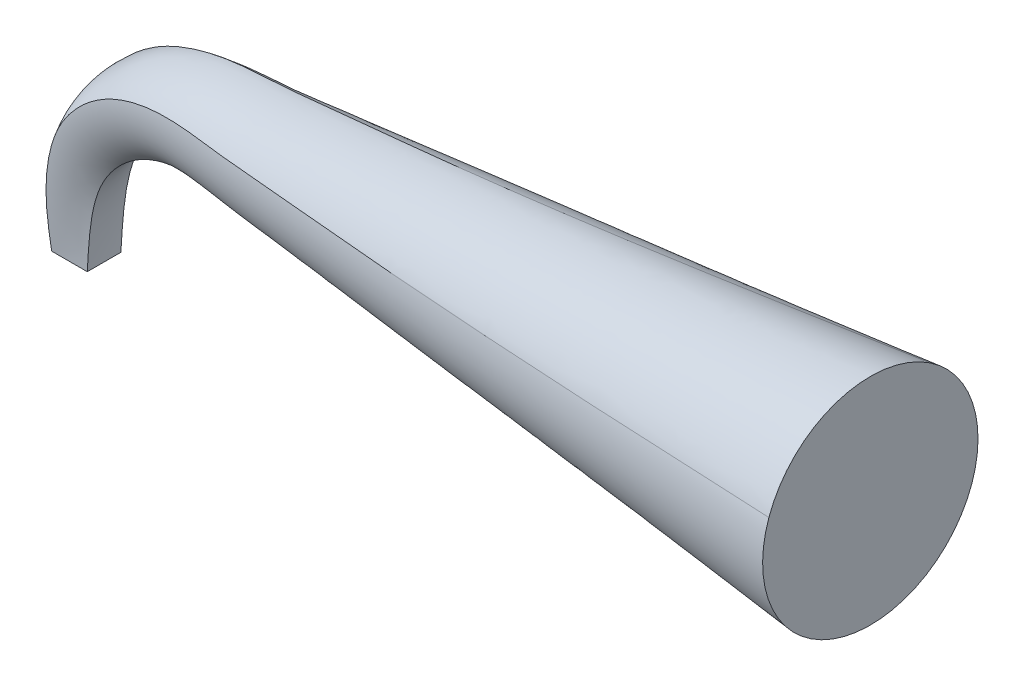
ISO-10303-21;
HEADER;
FILE_DESCRIPTION(('STEP AP214'),'2;1');
FILE_NAME('part.step','',(''),(''),'','','');
FILE_SCHEMA(('AUTOMOTIVE_DESIGN { 1 0 10303 214 1 1 1 1 }'));
ENDSEC;
DATA;
#1=APPLICATION_CONTEXT('core data for automotive mechanical design processes');
#2=APPLICATION_PROTOCOL_DEFINITION('international standard','automotive_design',2000,#1);
#3=PRODUCT_CONTEXT('',#1,'mechanical');
#4=PRODUCT('Part','Part','',(#3));
#5=PRODUCT_RELATED_PRODUCT_CATEGORY('part','',(#4));
#6=PRODUCT_DEFINITION_FORMATION('','',#4);
#7=PRODUCT_DEFINITION_CONTEXT('part definition',#1,'design');
#8=PRODUCT_DEFINITION('design','',#6,#7);
#9=PRODUCT_DEFINITION_SHAPE('','',#8);
#10=(LENGTH_UNIT() NAMED_UNIT(*) SI_UNIT(.MILLI.,.METRE.));
#11=(NAMED_UNIT(*) PLANE_ANGLE_UNIT() SI_UNIT($,.RADIAN.));
#12=(NAMED_UNIT(*) SI_UNIT($,.STERADIAN.) SOLID_ANGLE_UNIT());
#13=UNCERTAINTY_MEASURE_WITH_UNIT(LENGTH_MEASURE(1.E-05),#10,'distance_accuracy_value','');
#14=(GEOMETRIC_REPRESENTATION_CONTEXT(3) GLOBAL_UNCERTAINTY_ASSIGNED_CONTEXT((#13)) GLOBAL_UNIT_ASSIGNED_CONTEXT((#10,
#11,#12)) REPRESENTATION_CONTEXT('',''));
#15=CARTESIAN_POINT('',(0.,0.,0.));
#16=DIRECTION('',(0.,0.,1.));
#17=DIRECTION('',(1.,0.,0.));
#18=AXIS2_PLACEMENT_3D('',#15,#16,#17);
#19=CARTESIAN_POINT('',(0.,-14.8658428077113,0.));
#20=DIRECTION('',(0.,1.,0.));
#21=DIRECTION('',(0.,0.,1.));
#22=AXIS2_PLACEMENT_3D('',#19,#20,#21);
#23=PLANE('',#22);
#24=DIRECTION('',(0.,0.,-1.));
#25=VECTOR('',#24,1.);
#26=CARTESIAN_POINT('',(-37.7562589050252,-14.8658428077113,-2.65614978802375));
#27=LINE('',#26,#25);
#28=CARTESIAN_POINT('',(-37.7562589050252,-14.8658428077113,2.65614978802375));
#29=VERTEX_POINT('',#28);
#30=CARTESIAN_POINT('',(-37.7562589050252,-14.8658428077113,-2.65614978802375));
#31=VERTEX_POINT('',#30);
#32=EDGE_CURVE('E664',#29,#31,#27,.T.);
#33=ORIENTED_EDGE('',*,*,#32,.F.);
#34=DIRECTION('',(1.,0.,0.));
#35=VECTOR('',#34,1.);
#36=CARTESIAN_POINT('',(-43.3797484823993,-14.8658428077113,2.65614978802375));
#37=LINE('',#36,#35);
#38=CARTESIAN_POINT('',(-43.3797484823993,-14.8658428077113,2.65614978802375));
#39=VERTEX_POINT('',#38);
#40=EDGE_CURVE('E823',#39,#29,#37,.T.);
#41=ORIENTED_EDGE('',*,*,#40,.F.);
#42=DIRECTION('',(0.,0.,1.));
#43=VECTOR('',#42,1.);
#44=CARTESIAN_POINT('',(-43.3797484823993,-14.8658428077113,-2.65614978802375));
#45=LINE('',#44,#43);
#46=CARTESIAN_POINT('',(-43.3797484823993,-14.8658428077113,-2.65614978802375));
#47=VERTEX_POINT('',#46);
#48=EDGE_CURVE('E621',#47,#39,#45,.T.);
#49=ORIENTED_EDGE('',*,*,#48,.F.);
#50=DIRECTION('',(-1.,0.,0.));
#51=VECTOR('',#50,1.);
#52=CARTESIAN_POINT('',(-43.3797484823993,-14.8658428077113,-2.65614978802375));
#53=LINE('',#52,#51);
#54=EDGE_CURVE('E12',#31,#47,#53,.T.);
#55=ORIENTED_EDGE('',*,*,#54,.F.);
#56=EDGE_LOOP('',(#33,#41,#49,#55));
#57=FACE_BOUND('',#56,.T.);
#58=ADVANCED_FACE('F611',(#57),#23,.F.);
#59=CARTESIAN_POINT('',(83.3022903278959,12.9908716427748,0.));
#60=DIRECTION('',(1.,0.,0.));
#61=DIRECTION('',(0.,0.,-1.));
#62=AXIS2_PLACEMENT_3D('',#59,#60,#61);
#63=PLANE('',#62);
#64=CARTESIAN_POINT('',(83.3022903278959,12.9908716427748,0.));
#65=DIRECTION('',(1.,0.,0.));
#66=DIRECTION('',(0.,0.,-1.));
#67=AXIS2_PLACEMENT_3D('',#64,#65,#66);
#68=CIRCLE('',#67,17.0151066109591);
#69=CARTESIAN_POINT('',(83.3022903278959,7.26703543448097,-16.0234687893393));
#70=VERTEX_POINT('',#69);
#71=CARTESIAN_POINT('',(83.3022903278959,27.1609391444424,-9.41929084275922));
#72=VERTEX_POINT('',#71);
#73=EDGE_CURVE('E669',#70,#72,#68,.T.);
#74=ORIENTED_EDGE('',*,*,#73,.T.);
#75=CARTESIAN_POINT('',(83.3022903278959,18.7147078510685,16.0234687893393));
#76=VERTEX_POINT('',#75);
#77=EDGE_CURVE('E675',#72,#76,#68,.T.);
#78=ORIENTED_EDGE('',*,*,#77,.T.);
#79=CARTESIAN_POINT('',(83.3022903278959,-1.17919585889284,9.41929084275922));
#80=VERTEX_POINT('',#79);
#81=EDGE_CURVE('E682',#76,#80,#68,.T.);
#82=ORIENTED_EDGE('',*,*,#81,.T.);
#83=EDGE_CURVE('E661',#80,#70,#68,.T.);
#84=ORIENTED_EDGE('',*,*,#83,.T.);
#85=EDGE_LOOP('',(#74,#78,#82,#84));
#86=FACE_BOUND('',#85,.T.);
#87=ADVANCED_FACE('F680',(#86),#63,.T.);
#88=CARTESIAN_POINT('',(83.3022903278959,18.7147078510685,16.0234687893393));
#89=CARTESIAN_POINT('',(59.4671484831578,17.6866031237434,13.9655214002744));
#90=CARTESIAN_POINT('',(31.6611521907366,16.4872196074866,11.5647268993192));
#91=CARTESIAN_POINT('',(1.86249593572116,16.3277085159949,8.64374579440691));
#92=CARTESIAN_POINT('',(-6.09046461319388,16.302069926398,7.87200757897048));
#93=CARTESIAN_POINT('',(-14.0070974697454,16.1231621818383,7.09896208998436));
#94=CARTESIAN_POINT('',(-21.6394145775898,16.8023661881783,6.37364256727672));
#95=CARTESIAN_POINT('',(-29.5416184193723,14.490763397205,5.69863866024714));
#96=CARTESIAN_POINT('',(-34.0398916720471,11.9224103053131,5.26401443551942));
#97=CARTESIAN_POINT('',(-37.8693496106748,8.4034419487723,4.82917254576375));
#98=CARTESIAN_POINT('',(-41.8461583437446,2.80506078535319,4.25238007809928));
#99=CARTESIAN_POINT('',(-43.9062549306735,-6.09390078720985,3.52317263367582));
#100=CARTESIAN_POINT('',(-43.5554462583658,-11.9386028679906,2.94547955063633));
#101=CARTESIAN_POINT('',(-43.3797484823993,-14.8658428077113,2.65614978802375));
#102=CARTESIAN_POINT('',(83.3022903278959,19.9471575575961,15.5832182825441));
#103=CARTESIAN_POINT('',(59.4668962746293,18.6532763801234,13.6282697076644));
#104=CARTESIAN_POINT('',(31.6606057565872,17.1438389512212,11.3476332768399));
#105=CARTESIAN_POINT('',(1.86273752150273,16.7920835242675,8.41850760981032));
#106=CARTESIAN_POINT('',(-6.09089527557131,16.710789096605,7.64741540913035));
#107=CARTESIAN_POINT('',(-14.0047544170081,16.4741766197499,6.87458061331148));
#108=CARTESIAN_POINT('',(-21.6530432603866,17.1063893727034,6.14965248653869));
#109=CARTESIAN_POINT('',(-29.642191104706,14.7180682897851,5.47502602680539));
#110=CARTESIAN_POINT('',(-34.1661173034056,12.0944932213501,5.04066805810782));
#111=CARTESIAN_POINT('',(-38.0053006803104,8.52016280393007,4.60611070889627));
#112=CARTESIAN_POINT('',(-41.9713552326032,2.85596423940461,4.02972216600963));
#113=CARTESIAN_POINT('',(-43.9805982201532,-6.10384093487415,3.30106923767377));
#114=CARTESIAN_POINT('',(-43.5802549775418,-11.9419199438652,2.72388092670649));
#115=CARTESIAN_POINT('',(-43.3797484823993,-14.8658428077113,2.43480397235511));
#116=CARTESIAN_POINT('',(83.3022903278959,22.2757903317287,14.4334020381817));
#117=CARTESIAN_POINT('',(59.4664064890372,20.5100892688016,12.7558579700356));
#118=CARTESIAN_POINT('',(31.659544588771,18.4502283487746,10.7988407035516));
#119=CARTESIAN_POINT('',(1.86320667786223,17.6950095858538,7.87635984487074));
#120=CARTESIAN_POINT('',(-6.09173161615337,17.5030523518088,7.11901754364321));
#121=CARTESIAN_POINT('',(-14.0002042399023,17.1517258117347,6.35800669168116));
#122=CARTESIAN_POINT('',(-21.6795099802594,17.6911262037037,5.64491619222531));
#123=CARTESIAN_POINT('',(-29.8351222513398,15.1538939826627,4.9812757482182));
#124=CARTESIAN_POINT('',(-34.4076912122491,12.423725418236,4.55406530490237));
#125=CARTESIAN_POINT('',(-38.2649123178949,8.74299025922634,4.1266894408314));
#126=CARTESIAN_POINT('',(-42.2097899549434,2.95275316628998,3.55996976800172));
#127=CARTESIAN_POINT('',(-44.1210033716876,-6.12278637687138,2.84319318978067));
#128=CARTESIAN_POINT('',(-43.6271088630729,-11.9482421304871,2.2761221813254));
#129=CARTESIAN_POINT('',(-43.3797484823993,-14.8658428077113,1.99211234101782));
#130=CARTESIAN_POINT('',(83.3022903278958,25.2610991408168,11.9910558769082));
#131=CARTESIAN_POINT('',(59.4657369426437,22.9653146447811,10.8930710786742));
#132=CARTESIAN_POINT('',(31.6580939518074,20.28706017494,9.61216570677817));
#133=CARTESIAN_POINT('',(1.86384802369504,18.9323752461328,6.81473660416544));
#134=CARTESIAN_POINT('',(-6.09287490993218,18.583011873303,6.11085698177256));
#135=CARTESIAN_POINT('',(-13.9939840596442,18.0694573994466,5.39989874222563));
#136=CARTESIAN_POINT('',(-21.7156904990877,18.4786592428763,4.73484819925367));
#137=CARTESIAN_POINT('',(-30.0939103504947,15.7380283216807,4.11569278703309));
#138=CARTESIAN_POINT('',(-34.7305315868658,12.8634936371578,3.71719773152317));
#139=CARTESIAN_POINT('',(-38.610652997149,9.03960908809668,3.3185312786704));
#140=CARTESIAN_POINT('',(-42.5259590084605,3.08077722262854,2.7901341651939));
#141=CARTESIAN_POINT('',(-44.3048779538199,-6.14793196368965,2.12056975611542));
#142=CARTESIAN_POINT('',(-43.6884687101238,-11.9566333357493,1.59253430413464));
#143=CARTESIAN_POINT('',(-43.3797484823993,-14.8658428077113,1.32807489401188));
#144=CARTESIAN_POINT('',(83.3022903278958,27.6253068274766,8.96545296010281));
#145=CARTESIAN_POINT('',(59.465153765845,24.9825481490608,8.5385788631816));
#146=CARTESIAN_POINT('',(31.6568304429172,21.8995147653086,8.04058897775777));
#147=CARTESIAN_POINT('',(1.8644066377258,20.0131438227831,5.53139088912046));
#148=CARTESIAN_POINT('',(-6.0938707220408,19.5216300080666,4.90919717898448));
#149=CARTESIAN_POINT('',(-13.9885662650811,18.863441239699,4.27873678848819));
#150=CARTESIAN_POINT('',(-21.7472038331167,19.1569767639011,3.68912065124008));
#151=CARTESIAN_POINT('',(-30.3161238801586,16.2393064924891,3.13976990828147));
#152=CARTESIAN_POINT('',(-35.0069630458054,13.239902620727,2.78613323031179));
#153=CARTESIAN_POINT('',(-38.9059116272179,9.29282597075956,2.43221338876162));
#154=CARTESIAN_POINT('',(-42.7950391681216,3.18953655642361,1.96319426690898));
#155=CARTESIAN_POINT('',(-44.4601305278885,-6.16933695871119,1.36733536816577));
#156=CARTESIAN_POINT('',(-43.7402772531461,-11.9637762872406,0.898731401837153));
#157=CARTESIAN_POINT('',(-43.3797484823993,-14.8658428077113,0.664037447005939));
#158=CARTESIAN_POINT('',(83.3022903278958,29.2823941340328,5.40829568301892));
#159=CARTESIAN_POINT('',(59.4646799937253,26.4909350873546,5.75903896365752));
#160=CARTESIAN_POINT('',(31.6558039698364,23.2344283542295,6.16821489491725));
#161=CARTESIAN_POINT('',(1.86486045508278,20.8916569478438,4.05648409795279));
#162=CARTESIAN_POINT('',(-6.09467971858278,20.283602886956,3.54181365332546));
#163=CARTESIAN_POINT('',(-13.9841648553887,19.5064064802278,3.01783365611972));
#164=CARTESIAN_POINT('',(-21.7728052272303,19.7052076317172,2.52743132268584));
#165=CARTESIAN_POINT('',(-30.4954600685009,16.6437434424153,2.06965528173662));
#166=CARTESIAN_POINT('',(-35.2297566751884,13.5432254715207,1.77474437932767));
#167=CARTESIAN_POINT('',(-39.1435998255059,9.49662579364012,1.47933126458702));
#168=CARTESIAN_POINT('',(-43.0112360314109,3.27686855459894,1.08764938913342));
#169=CARTESIAN_POINT('',(-44.5849319032217,-6.18651523483484,0.588562908328371));
#170=CARTESIAN_POINT('',(-43.7819240822694,-11.9695087619705,0.196406320090849));
#171=CARTESIAN_POINT('',(-43.3797484823993,-14.8658428077113,0.));
#172=CARTESIAN_POINT('',(83.302290327896,30.0815886290647,1.56634378397464));
#173=CARTESIAN_POINT('',(59.464338661369,27.385939124655,2.72256893280868));
#174=CARTESIAN_POINT('',(31.6550644403013,24.2412034812282,4.07141730178875));
#175=CARTESIAN_POINT('',(1.86518741089426,21.522158442408,2.42047226684268));
#176=CARTESIAN_POINT('',(-6.09526256566168,20.8336447122258,2.03642748598917));
#177=CARTESIAN_POINT('',(-13.9809938297426,19.9710716461057,1.64053416964172));
#178=CARTESIAN_POINT('',(-21.791249926312,20.1024819618183,1.26947422101982));
#179=CARTESIAN_POINT('',(-30.6256161436914,16.9373539218696,0.921497670349468));
#180=CARTESIAN_POINT('',(-35.3916835611352,13.7637353448068,0.696903597909309));
#181=CARTESIAN_POINT('',(-39.3166292094171,9.64499342935761,0.471480441216132));
#182=CARTESIAN_POINT('',(-43.1687551958126,3.34061061197514,0.171998824065802));
#183=CARTESIAN_POINT('',(-44.6774528891477,-6.19898066745874,-0.21067473347134));
#184=CARTESIAN_POINT('',(-43.8127987876233,-11.9736685377826,-0.512748092933947));
#185=CARTESIAN_POINT('',(-43.3797484823993,-14.8658428077113,-0.664037447005939));
#186=CARTESIAN_POINT('',(83.3022903278957,29.9961592544968,-2.2724649919094));
#187=CARTESIAN_POINT('',(59.4641328980126,27.6311538040599,-0.378947772640131));
#188=CARTESIAN_POINT('',(31.6546186341058,24.8721464016801,1.83002304539007));
#189=CARTESIAN_POINT('',(1.86538450772338,21.9009318041763,0.681126946014085));
#190=CARTESIAN_POINT('',(-6.09561391990307,21.1658055902829,0.43986653992929));
#191=CARTESIAN_POINT('',(-13.979082259194,20.2519683368805,0.184407349878628));
#192=CARTESIAN_POINT('',(-21.8023688346644,20.3432173883437,-0.0552648738944733));
#193=CARTESIAN_POINT('',(-30.7045945247762,17.1155595621467,-0.281900256195916));
#194=CARTESIAN_POINT('',(-35.4900604219825,13.8977353575646,-0.428629197348179));
#195=CARTESIAN_POINT('',(-39.4219096679331,9.73526597349559,-0.576384173090899));
#196=CARTESIAN_POINT('',(-43.2646178651434,3.37947715242363,-0.773391721707732));
#197=CARTESIAN_POINT('',(-44.7349731594893,-6.20652471046123,-1.02589538487717));
#198=CARTESIAN_POINT('',(-43.8319935830625,-11.9761860218167,-1.22723611440789));
#199=CARTESIAN_POINT('',(-43.3797484823993,-14.8658428077113,-1.32807489401188));
#200=CARTESIAN_POINT('',(83.302290327896,29.0641281259972,-6.01525024257688));
#201=CARTESIAN_POINT('',(59.4640658328935,27.2238543093877,-3.45508760857082));
#202=CARTESIAN_POINT('',(31.654473331044,25.0769970657846,-0.468410492366303));
#203=CARTESIAN_POINT('',(1.86544874813328,22.0243583417954,-1.10407495227228));
#204=CARTESIAN_POINT('',(-6.09572843793255,21.2741175561356,-1.20098688504774));
#205=CARTESIAN_POINT('',(-13.9784592147943,20.3436387747625,-1.31300978121581));
#206=CARTESIAN_POINT('',(-21.8059928565897,20.4218302948775,-1.41729641512111));
#207=CARTESIAN_POINT('',(-30.7303976308018,17.1737821914588,-1.51773642139306));
#208=CARTESIAN_POINT('',(-35.5222039760672,13.9415285740828,-1.58309393112877));
#209=CARTESIAN_POINT('',(-39.4563510900353,9.76478053544346,-1.64930771166156));
#210=CARTESIAN_POINT('',(-43.2958452432199,3.39218259191899,-1.73815651781318));
#211=CARTESIAN_POINT('',(-44.7547723880691,-6.20893881522129,-1.85261688106176));
#212=CARTESIAN_POINT('',(-43.8386006824412,-11.976991620378,-1.94556202401404));
#213=CARTESIAN_POINT('',(-43.3797484823993,-14.8658428077113,-1.99211234101782));
#214=CARTESIAN_POINT('',(83.3022903278959,27.8854266063944,-8.3293960288769));
#215=CARTESIAN_POINT('',(59.4641144761404,26.5394056407437,-5.39975191373873));
#216=CARTESIAN_POINT('',(31.6545787213393,24.9691421103561,-1.98203894461581));
#217=CARTESIAN_POINT('',(1.86540215368656,21.9340362917968,-2.29140112508035));
#218=CARTESIAN_POINT('',(-6.09564537644164,21.195455427212,-2.29648644875305));
#219=CARTESIAN_POINT('',(-13.9789111174072,20.2759367473047,-2.31615411418167));
#220=CARTESIAN_POINT('',(-21.8033643039888,20.3633047450965,-2.33208176879812));
#221=CARTESIAN_POINT('',(-30.7110423462335,17.1300371206973,-2.34907693752134));
#222=CARTESIAN_POINT('',(-35.497915611074,13.9084222212527,-2.36025429425784));
#223=CARTESIAN_POINT('',(-39.430214680171,9.74233277519843,-2.3718124525904));
#224=CARTESIAN_POINT('',(-43.2717131294146,3.38239356910607,-2.38760292101918));
#225=CARTESIAN_POINT('',(-44.7409711803478,-6.20700140417576,-2.40836004859291));
#226=CARTESIAN_POINT('',(-43.8339951519483,-11.9763450968398,-2.42597950570693));
#227=CARTESIAN_POINT('',(-43.3797484823993,-14.8658428077113,-2.43480397235511));
#228=CARTESIAN_POINT('',(83.3022903278959,27.1609391444424,-9.41929084275922));
#229=CARTESIAN_POINT('',(59.4641623580543,26.1007433043147,-6.32708378326255));
#230=CARTESIAN_POINT('',(31.6546824621329,24.8639224038198,-2.71972543012798));
#231=CARTESIAN_POINT('',(1.86535628850642,21.8451335473341,-2.87602832305215));
#232=CARTESIAN_POINT('',(-6.09556361497623,21.1179967816613,-2.83765074247014));
#233=CARTESIAN_POINT('',(-13.9793559471285,20.2092160157757,-2.8132788890416));
#234=CARTESIAN_POINT('',(-21.8007768918173,20.3055952660766,-2.78664105925573));
#235=CARTESIAN_POINT('',(-30.6919485721665,17.0868816827361,-2.76306571446377));
#236=CARTESIAN_POINT('',(-35.473951612513,13.8757525936405,-2.74777108373338));
#237=CARTESIAN_POINT('',(-39.4044043023416,9.72017315852198,-2.7324995281834));
#238=CARTESIAN_POINT('',(-43.2479444381261,3.37272958298973,-2.71223201623955));
#239=CARTESIAN_POINT('',(-44.7268570700603,-6.20511428115657,-2.68661257688272));
#240=CARTESIAN_POINT('',(-43.8292852043391,-11.9757153546619,-2.66631536960362));
#241=CARTESIAN_POINT('',(-43.3797484823993,-14.8658428077113,-2.65614978802375));
#242=B_SPLINE_SURFACE_WITH_KNOTS('',3,3,((#88,#89,#90,#91,#92,#93,#94,#95,#96,#97,#98,#99,#100,
#101),(#102,#103,#104,#105,#106,#107,#108,#109,#110,#111,#112,#113,#114,#115),(#116,#117,#118,
#119,#120,#121,#122,#123,#124,#125,#126,#127,#128,#129),(#130,#131,#132,#133,#134,#135,#136,
#137,#138,#139,#140,#141,#142,#143),(#144,#145,#146,#147,#148,#149,#150,#151,#152,#153,#154,
#155,#156,#157),(#158,#159,#160,#161,#162,#163,#164,#165,#166,#167,#168,#169,#170,#171),(#172,
#173,#174,#175,#176,#177,#178,#179,#180,#181,#182,#183,#184,#185),(#186,#187,#188,#189,#190,
#191,#192,#193,#194,#195,#196,#197,#198,#199),(#200,#201,#202,#203,#204,#205,#206,#207,#208,
#209,#210,#211,#212,#213),(#214,#215,#216,#217,#218,#219,#220,#221,#222,#223,#224,#225,#226,
#227),(#228,#229,#230,#231,#232,#233,#234,#235,#236,#237,#238,#239,#240,#241)),.UNSPECIFIED.,
.F.,.F.,.F.,(4,1,1,1,1,1,1,1,4),(4,1,1,1,1,1,1,1,1,1,1,4),(0.,0.125,0.25,0.375,0.5,0.625,0.75,
0.875,1.),(0.,0.499955334191522,0.583246210971245,0.624892237351533,0.66653853443384,
0.74987029173389,0.78119223596549,0.812519559618633,0.843851127957191,0.875188208299718,
0.937489703228063,1.),.UNSPECIFIED.);
#243=CARTESIAN_POINT('',(83.3022903278959,27.1609391444424,-9.41929084275922));
#244=CARTESIAN_POINT('',(59.4641623580543,26.1007433043147,-6.32708378326255));
#245=CARTESIAN_POINT('',(31.6546824621329,24.8639224038198,-2.71972543012798));
#246=CARTESIAN_POINT('',(1.86535628850642,21.8451335473341,-2.87602832305215));
#247=CARTESIAN_POINT('',(-6.09556361497623,21.1179967816613,-2.83765074247014));
#248=CARTESIAN_POINT('',(-13.9793559471285,20.2092160157757,-2.8132788890416));
#249=CARTESIAN_POINT('',(-21.8007768918173,20.3055952660766,-2.78664105925573));
#250=CARTESIAN_POINT('',(-30.6919485721665,17.0868816827361,-2.76306571446377));
#251=CARTESIAN_POINT('',(-35.473951612513,13.8757525936405,-2.74777108373338));
#252=CARTESIAN_POINT('',(-39.4044043023416,9.72017315852198,-2.7324995281834));
#253=CARTESIAN_POINT('',(-43.2479444381261,3.37272958298973,-2.71223201623955));
#254=CARTESIAN_POINT('',(-44.7268570700603,-6.20511428115657,-2.68661257688272));
#255=CARTESIAN_POINT('',(-43.8292852043391,-11.9757153546619,-2.66631536960362));
#256=CARTESIAN_POINT('',(-43.3797484823993,-14.8658428077113,-2.65614978802375));
#257=B_SPLINE_CURVE_WITH_KNOTS('',3,(#243,#244,#245,#246,#247,#248,#249,#250,#251,#252,#253,
#254,#255,#256),.UNSPECIFIED.,.F.,.F.,(4,1,1,1,1,1,1,1,1,1,1,4),(0.,0.499955334191522,
0.583246210971245,0.624892237351533,0.66653853443384,0.74987029173389,0.78119223596549,
0.812519559618633,0.843851127957191,0.875188208299718,0.937489703228063,1.),.UNSPECIFIED.);
#258=EDGE_CURVE('E636',#72,#47,#257,.T.);
#259=CARTESIAN_POINT('',(83.3022903278959,18.7147078510685,16.0234687893393));
#260=CARTESIAN_POINT('',(59.4671484831578,17.6866031237434,13.9655214002744));
#261=CARTESIAN_POINT('',(31.6611521907366,16.4872196074866,11.5647268993192));
#262=CARTESIAN_POINT('',(1.86249593572116,16.3277085159949,8.64374579440691));
#263=CARTESIAN_POINT('',(-6.09046461319388,16.302069926398,7.87200757897048));
#264=CARTESIAN_POINT('',(-14.0070974697454,16.1231621818383,7.09896208998436));
#265=CARTESIAN_POINT('',(-21.6394145775898,16.8023661881783,6.37364256727672));
#266=CARTESIAN_POINT('',(-29.5416184193723,14.490763397205,5.69863866024714));
#267=CARTESIAN_POINT('',(-34.0398916720471,11.9224103053131,5.26401443551942));
#268=CARTESIAN_POINT('',(-37.8693496106748,8.4034419487723,4.82917254576375));
#269=CARTESIAN_POINT('',(-41.8461583437446,2.80506078535319,4.25238007809928));
#270=CARTESIAN_POINT('',(-43.9062549306735,-6.09390078720985,3.52317263367582));
#271=CARTESIAN_POINT('',(-43.5554462583658,-11.9386028679906,2.94547955063633));
#272=CARTESIAN_POINT('',(-43.3797484823993,-14.8658428077113,2.65614978802375));
#273=B_SPLINE_CURVE_WITH_KNOTS('',3,(#259,#260,#261,#262,#263,#264,#265,#266,#267,#268,#269,
#270,#271,#272),.UNSPECIFIED.,.F.,.F.,(4,1,1,1,1,1,1,1,1,1,1,4),(0.,0.499955334191522,
0.583246210971245,0.624892237351533,0.66653853443384,0.74987029173389,0.78119223596549,
0.812519559618633,0.843851127957191,0.875188208299718,0.937489703228063,1.),.UNSPECIFIED.);
#274=EDGE_CURVE('E674',#39,#76,#273,.F.);
#275=ORIENTED_EDGE('',*,*,#77,.F.);
#276=ORIENTED_EDGE('',*,*,#258,.T.);
#277=ORIENTED_EDGE('',*,*,#48,.T.);
#278=ORIENTED_EDGE('',*,*,#274,.T.);
#279=EDGE_LOOP('',(#275,#276,#277,#278));
#280=FACE_BOUND('',#279,.T.);
#281=ADVANCED_FACE('F703',(#280),#242,.T.);
#282=CARTESIAN_POINT('',(83.3022903278959,27.1609391444424,-9.41929084275922));
#283=CARTESIAN_POINT('',(59.4641623580543,26.1007433043147,-6.32708378326255));
#284=CARTESIAN_POINT('',(31.6546824621329,24.8639224038198,-2.71972543012799));
#285=CARTESIAN_POINT('',(1.86535628850642,21.8451335473341,-2.87602832305215));
#286=CARTESIAN_POINT('',(-6.09556361497623,21.1179967816613,-2.83765074247014));
#287=CARTESIAN_POINT('',(-13.9793559471285,20.2092160157757,-2.8132788890416));
#288=CARTESIAN_POINT('',(-21.8007768918173,20.3055952660766,-2.78664105925573));
#289=CARTESIAN_POINT('',(-30.6919485721665,17.0868816827361,-2.76306571446377));
#290=CARTESIAN_POINT('',(-35.473951612513,13.8757525936405,-2.74777108373338));
#291=CARTESIAN_POINT('',(-39.4044043023416,9.72017315852198,-2.73249952818339));
#292=CARTESIAN_POINT('',(-43.2479444381261,3.37272958298973,-2.71223201623955));
#293=CARTESIAN_POINT('',(-44.7268570700603,-6.20511428115657,-2.68661257688272));
#294=CARTESIAN_POINT('',(-43.8292852043391,-11.9757153546619,-2.66631536960362));
#295=CARTESIAN_POINT('',(-43.3797484823993,-14.8658428077113,-2.65614978802375));
#296=CARTESIAN_POINT('',(83.3022903278959,26.0795304179896,-11.0461261222439));
#297=CARTESIAN_POINT('',(59.4643048219652,25.3410693094286,-7.86858529794283));
#298=CARTESIAN_POINT('',(31.654991123963,24.4795830644337,-4.16167686185825));
#299=CARTESIAN_POINT('',(1.86521982501941,21.4139052371295,-3.8713888186393));
#300=CARTESIAN_POINT('',(-6.09532034863263,20.6824589204117,-3.71583266118373));
#301=CARTESIAN_POINT('',(-13.9806794569175,19.7708680746405,-3.57088816762654));
#302=CARTESIAN_POINT('',(-21.7930785183214,19.8485444489886,-3.42791754213267));
#303=CARTESIAN_POINT('',(-30.51332574135,16.6694031708846,-3.29311251040476));
#304=CARTESIAN_POINT('',(-35.2089011788396,13.5050924145361,-3.20518491095108));
#305=CARTESIAN_POINT('',(-39.061055641009,9.41728473145399,-3.11622647972752));
#306=CARTESIAN_POINT('',(-42.8225593810621,3.17152273252291,-2.99683590720003));
#307=CARTESIAN_POINT('',(-44.2543177899368,-6.18095718321021,-2.84357388077179));
#308=CARTESIAN_POINT('',(-43.3593545686364,-11.9676540129691,-2.71869412412125));
#309=CARTESIAN_POINT('',(-42.9111243509515,-14.8658428077113,-2.65614978802375));
#310=CARTESIAN_POINT('',(83.3022903278957,23.4311938953562,-13.8270543690983));
#311=CARTESIAN_POINT('',(59.4648133969158,23.2798502918724,-10.6827611728308));
#312=CARTESIAN_POINT('',(31.6560930007405,23.1032933531823,-7.01463930776196));
#313=CARTESIAN_POINT('',(1.86473267068849,20.167772067002,-5.77336506808577));
#314=CARTESIAN_POINT('',(-6.09445192400529,19.4447938988702,-5.36957055890207));
#315=CARTESIAN_POINT('',(-13.9854041898101,18.5893635503382,-4.98675121700908));
#316=CARTESIAN_POINT('',(-21.7655964711325,18.6690575685374,-4.61547238392041));
#317=CARTESIAN_POINT('',(-30.0688205452886,15.6374763647718,-4.26771997537226));
#318=CARTESIAN_POINT('',(-34.5697692176826,12.6151840693167,-4.04207762283905));
#319=CARTESIAN_POINT('',(-38.2573405159739,8.71113817955846,-3.81476584592431));
#320=CARTESIAN_POINT('',(-41.8648719591129,2.7256725467037,-3.51157808585532));
#321=CARTESIAN_POINT('',(-43.2444673331304,-6.1242346373828,-3.1219243502354));
#322=CARTESIAN_POINT('',(-42.3978785986685,-11.9487254221006,-2.81158103668287));
#323=CARTESIAN_POINT('',(-41.9738760880558,-14.8658428077113,-2.65614978802376));
#324=CARTESIAN_POINT('',(83.3022903278958,18.4460811535606,-16.4328419983655));
#325=CARTESIAN_POINT('',(59.4661244941624,18.8845475431825,-13.6244741881927));
#326=CARTESIAN_POINT('',(31.658933619624,19.3960609582733,-10.3482417484575));
#327=CARTESIAN_POINT('',(1.86347679542175,17.2028919776965,-7.91382696760732));
#328=CARTESIAN_POINT('',(-6.0922131406438,16.7209238766062,-7.23840493989337));
#329=CARTESIAN_POINT('',(-13.9975844678151,16.0661459971442,-6.56291076787355));
#330=CARTESIAN_POINT('',(-21.6947482385398,16.268601622822,-5.92733611102723));
#331=CARTESIAN_POINT('',(-29.1954494199289,13.6235625723586,-5.33500713641296));
#332=CARTESIAN_POINT('',(-33.3546013466344,10.9312240008606,-4.95331761229426));
#333=CARTESIAN_POINT('',(-36.7783282431589,7.41748075249482,-4.57089396223265));
#334=CARTESIAN_POINT('',(-40.1798758049697,1.95656517433299,-4.0642863571861));
#335=CARTESIAN_POINT('',(-41.5861766105569,-6.01942423765978,-3.41549220202805));
#336=CARTESIAN_POINT('',(-40.9077729740796,-11.9137496792776,-2.90954606412798));
#337=CARTESIAN_POINT('',(-40.5680036937123,-14.8658428077113,-2.65614978802375));
#338=CARTESIAN_POINT('',(83.3022903278957,12.8923097052578,-17.3256470819483));
#339=CARTESIAN_POINT('',(59.4678263106321,13.6460709257788,-14.9011776215238));
#340=CARTESIAN_POINT('',(31.6626207694624,14.5254062299153,-12.072799705135));
#341=CARTESIAN_POINT('',(1.86184665759752,13.5626859457287,-8.95193746661224));
#342=CARTESIAN_POINT('',(-6.08930717893375,13.3617603094649,-8.14396618939621));
#343=CARTESIAN_POINT('',(-14.0133945824109,13.0239811978457,-7.33258595154475));
#344=CARTESIAN_POINT('',(-21.6027865710209,13.4233446310472,-6.570931950554));
#345=CARTESIAN_POINT('',(-28.1775209419635,11.284056616107,-5.86130714141311));
#346=CARTESIAN_POINT('',(-31.9606593842159,9.00402887415613,-5.4041911015522));
#347=CARTESIAN_POINT('',(-35.1095567925624,5.96115954988674,-4.94651447599349));
#348=CARTESIAN_POINT('',(-38.3227869041233,1.11832236144652,-4.33956758885514));
#349=CARTESIAN_POINT('',(-39.8338784882662,-5.90077163004212,-3.56849814664319));
#350=CARTESIAN_POINT('',(-39.3862966205873,-11.8741547240033,-2.9606048959175));
#351=CARTESIAN_POINT('',(-39.1621312993688,-14.8658428077113,-2.65614978802376));
#352=CARTESIAN_POINT('',(83.3022903278959,9.10665576960998,-16.6806102374339));
#353=CARTESIAN_POINT('',(59.4690300542628,10.068136344516,-14.4690354498719));
#354=CARTESIAN_POINT('',(31.6652287963628,11.1897963486907,-11.8890197426469));
#355=CARTESIAN_POINT('',(1.86069361433004,11.0030528209838,-8.87564944461547));
#356=CARTESIAN_POINT('',(-6.08725170881612,11.0073943917593,-8.07616106071613));
#357=CARTESIAN_POINT('',(-14.0245775302095,10.8833923268395,-7.27519856518896));
#358=CARTESIAN_POINT('',(-21.5377394443152,11.4223966604008,-6.52277339337302));
#359=CARTESIAN_POINT('',(-27.4625728315235,9.64145357498962,-5.82190797754277));
#360=CARTESIAN_POINT('',(-30.9836981076458,7.65388700773839,-5.37039104710778));
#361=CARTESIAN_POINT('',(-33.9436709576282,4.94421007513829,-4.91841271450309));
#362=CARTESIAN_POINT('',(-37.0331341528118,0.538020056301838,-4.31856794732857));
#363=CARTESIAN_POINT('',(-38.6321455670269,-5.81757330121748,-3.55967579819792));
#364=CARTESIAN_POINT('',(-38.3607885340929,-11.8463910349041,-2.95766083510739));
#365=CARTESIAN_POINT('',(-38.224883036473,-14.8658428077113,-2.65614978802375));
#366=CARTESIAN_POINT('',(83.3022903278959,7.26703543448097,-16.0234687893393));
#367=CARTESIAN_POINT('',(59.4696072073714,8.35587217001779,-13.9655214002744));
#368=CARTESIAN_POINT('',(31.6664792543464,9.62610544274625,-11.5647268993192));
#369=CARTESIAN_POINT('',(1.86014077027809,9.77403937924959,-8.64374579440691));
#370=CARTESIAN_POINT('',(-6.08626618254789,9.86658344265721,-7.87200757897048));
#371=CARTESIAN_POINT('',(-14.0299393638441,9.83903816533405,-7.09896208998436));
#372=CARTESIAN_POINT('',(-21.5065516145866,10.4395813699029,-6.37364256727672));
#373=CARTESIAN_POINT('',(-27.1098786547323,8.83049213308572,-5.69863866024714));
#374=CARTESIAN_POINT('',(-30.5000010861397,6.98511472953614,-5.26401443551942));
#375=CARTESIAN_POINT('',(-33.3646577049179,4.43897048710549,-4.82917254576375));
#376=CARTESIAN_POINT('',(-36.3905122641876,0.248446092186154,-4.25238007809928));
#377=CARTESIAN_POINT('',(-38.0303954222818,-5.77616688522552,-3.52317263367582));
#378=CARTESIAN_POINT('',(-37.8477396011326,-11.8325735114447,-2.94547955063633));
#379=CARTESIAN_POINT('',(-37.7562589050252,-14.8658428077113,-2.65614978802375));
#380=B_SPLINE_SURFACE_WITH_KNOTS('',3,3,((#282,#283,#284,#285,#286,#287,#288,#289,#290,#291,
#292,#293,#294,#295),(#296,#297,#298,#299,#300,#301,#302,#303,#304,#305,#306,#307,#308,#309),
(#310,#311,#312,#313,#314,#315,#316,#317,#318,#319,#320,#321,#322,#323),(#324,#325,#326,#327,
#328,#329,#330,#331,#332,#333,#334,#335,#336,#337),(#338,#339,#340,#341,#342,#343,#344,#345,
#346,#347,#348,#349,#350,#351),(#352,#353,#354,#355,#356,#357,#358,#359,#360,#361,#362,#363,
#364,#365),(#366,#367,#368,#369,#370,#371,#372,#373,#374,#375,#376,#377,#378,#379)),
.UNSPECIFIED.,.F.,.F.,.F.,(4,1,1,1,4),(4,1,1,1,1,1,1,1,1,1,1,4),(0.,0.25,0.5,0.75,1.),(0.,
0.499955334191522,0.583246210971245,0.624892237351533,0.66653853443384,0.74987029173389,
0.78119223596549,0.812519559618633,0.843851127957191,0.875188208299718,0.937489703228063,1.),.UNSPECIFIED.);
#381=CARTESIAN_POINT('',(83.3022903278959,7.26703543448097,-16.0234687893393));
#382=CARTESIAN_POINT('',(59.4696072073714,8.35587217001779,-13.9655214002744));
#383=CARTESIAN_POINT('',(31.6664792543464,9.62610544274625,-11.5647268993192));
#384=CARTESIAN_POINT('',(1.86014077027809,9.77403937924959,-8.64374579440691));
#385=CARTESIAN_POINT('',(-6.08626618254789,9.86658344265721,-7.87200757897048));
#386=CARTESIAN_POINT('',(-14.0299393638441,9.83903816533405,-7.09896208998436));
#387=CARTESIAN_POINT('',(-21.5065516145866,10.4395813699029,-6.37364256727672));
#388=CARTESIAN_POINT('',(-27.1098786547323,8.83049213308572,-5.69863866024714));
#389=CARTESIAN_POINT('',(-30.5000010861397,6.98511472953614,-5.26401443551942));
#390=CARTESIAN_POINT('',(-33.3646577049179,4.43897048710549,-4.82917254576375));
#391=CARTESIAN_POINT('',(-36.3905122641876,0.248446092186154,-4.25238007809928));
#392=CARTESIAN_POINT('',(-38.0303954222818,-5.77616688522552,-3.52317263367582));
#393=CARTESIAN_POINT('',(-37.8477396011326,-11.8325735114447,-2.94547955063633));
#394=CARTESIAN_POINT('',(-37.7562589050252,-14.8658428077113,-2.65614978802375));
#395=B_SPLINE_CURVE_WITH_KNOTS('',3,(#381,#382,#383,#384,#385,#386,#387,#388,#389,#390,#391,
#392,#393,#394),.UNSPECIFIED.,.F.,.F.,(4,1,1,1,1,1,1,1,1,1,1,4),(0.,0.499955334191522,
0.583246210971245,0.624892237351533,0.66653853443384,0.74987029173389,0.78119223596549,
0.812519559618633,0.843851127957191,0.875188208299718,0.937489703228063,1.),.UNSPECIFIED.);
#396=EDGE_CURVE('E656',#70,#31,#395,.T.);
#397=ORIENTED_EDGE('',*,*,#73,.F.);
#398=ORIENTED_EDGE('',*,*,#396,.T.);
#399=ORIENTED_EDGE('',*,*,#54,.T.);
#400=ORIENTED_EDGE('',*,*,#258,.F.);
#401=EDGE_LOOP('',(#397,#398,#399,#400));
#402=FACE_BOUND('',#401,.T.);
#403=ADVANCED_FACE('F671',(#402),#380,.T.);
#404=CARTESIAN_POINT('',(83.3022903278959,-1.17919585889285,9.41929084275922));
#405=CARTESIAN_POINT('',(59.4725933324749,-0.0582680105534544,6.32708378326255));
#406=CARTESIAN_POINT('',(31.6729489829501,1.24940264641298,2.71972543012798));
#407=CARTESIAN_POINT('',(1.85728041749284,4.25661434791036,2.87602832305214));
#408=CARTESIAN_POINT('',(-6.08116718076555,5.05065658739396,2.83765074247013));
#409=CARTESIAN_POINT('',(-14.057680886461,5.75298433139661,2.81327888904159));
#410=CARTESIAN_POINT('',(-21.3451893003591,6.93635229200459,2.78664105925573));
#411=CARTESIAN_POINT('',(-25.9595485019381,6.23437384755462,2.76306571446377));
#412=CARTESIAN_POINT('',(-29.0659411456738,5.0317724412088,2.74777108373337));
#413=CARTESIAN_POINT('',(-31.829603013251,3.12223927735581,2.73249952818339));
#414=CARTESIAN_POINT('',(-34.9887261698061,-0.319222705450387,2.71223201623955));
#415=CARTESIAN_POINT('',(-37.2097932828951,-5.6649533912788,2.68661257688272));
#416=CARTESIAN_POINT('',(-37.5739006551593,-11.7954610247735,2.66631536960362));
#417=CARTESIAN_POINT('',(-37.7562589050252,-14.8658428077113,2.65614978802375));
#418=CARTESIAN_POINT('',(83.3022903278959,-0.0977871324401238,11.0461261222439));
#419=CARTESIAN_POINT('',(59.4724508685641,0.701405984332588,7.86858529794283));
#420=CARTESIAN_POINT('',(31.6726403211201,1.63374198579911,4.16167686185825));
#421=CARTESIAN_POINT('',(1.85741688097985,4.68784265811494,3.87138881863929));
#422=CARTESIAN_POINT('',(-6.08141044710915,5.48619444864354,3.71583266118373));
#423=CARTESIAN_POINT('',(-14.0563573766721,6.19133227253175,3.57088816762654));
#424=CARTESIAN_POINT('',(-21.352887673855,7.39340310909264,3.42791754213267));
#425=CARTESIAN_POINT('',(-26.1381713327546,6.65185235940616,3.29311251040476));
#426=CARTESIAN_POINT('',(-29.3309915793472,5.40243262031321,3.20518491095108));
#427=CARTESIAN_POINT('',(-32.1729516745837,3.4251277044238,3.11622647972752));
#428=CARTESIAN_POINT('',(-35.4141112268702,-0.118015854983572,2.99683590720003));
#429=CARTESIAN_POINT('',(-37.6823325630186,-5.68911048922515,2.84357388077179));
#430=CARTESIAN_POINT('',(-38.043831290862,-11.8035223664662,2.71869412412125));
#431=CARTESIAN_POINT('',(-38.224883036473,-14.8658428077113,2.65614978802375));
#432=CARTESIAN_POINT('',(83.3022903278957,2.55054939019326,13.8270543690983));
#433=CARTESIAN_POINT('',(59.4719422936133,2.7626250018889,10.6827611728308));
#434=CARTESIAN_POINT('',(31.6715384443429,3.01003169705081,7.01463930776192));
#435=CARTESIAN_POINT('',(1.85790403531075,5.93397582824237,5.77336506808578));
#436=CARTESIAN_POINT('',(-6.08227887173648,6.72385947018506,5.36957055890207));
#437=CARTESIAN_POINT('',(-14.0516326437796,7.37283679683408,4.98675121700909));
#438=CARTESIAN_POINT('',(-21.380369721044,8.57288998954385,4.6154723839204));
#439=CARTESIAN_POINT('',(-26.5826765288161,7.6837791655189,4.26771997537226));
#440=CARTESIAN_POINT('',(-29.9701235405043,6.29234096553258,4.04207762283903));
#441=CARTESIAN_POINT('',(-32.976666799619,4.13127425631934,3.81476584592431));
#442=CARTESIAN_POINT('',(-36.3717986488193,0.327834330835653,3.51157808585531));
#443=CARTESIAN_POINT('',(-38.6921830198251,-5.7458330350526,3.12192435023541));
#444=CARTESIAN_POINT('',(-39.0053072608299,-11.8224509573348,2.81158103668287));
#445=CARTESIAN_POINT('',(-39.1621312993688,-14.8658428077113,2.65614978802376));
#446=CARTESIAN_POINT('',(83.3022903278958,7.53566213198889,16.4328419983655));
#447=CARTESIAN_POINT('',(59.4706311963667,7.15792775057867,13.6244741881928));
#448=CARTESIAN_POINT('',(31.6686978254588,6.71726409195937,10.3482417484576));
#449=CARTESIAN_POINT('',(1.85915991057753,8.89885591754804,7.91382696760727));
#450=CARTESIAN_POINT('',(-6.08451765509799,9.44772949244896,7.23840493989336));
#451=CARTESIAN_POINT('',(-14.0394523657743,9.89605435002812,6.56291076787354));
#452=CARTESIAN_POINT('',(-21.4512179536366,10.9733459352592,5.92733611102723));
#453=CARTESIAN_POINT('',(-27.4560476541756,9.69769295793217,5.33500713641296));
#454=CARTESIAN_POINT('',(-31.1852914115524,7.97630103398866,4.95331761229426));
#455=CARTESIAN_POINT('',(-34.4556790724335,5.42493168338297,4.57089396223265));
#456=CARTESIAN_POINT('',(-38.0567948029626,1.09694170320634,4.06428635718611));
#457=CARTESIAN_POINT('',(-40.3504737423985,-5.85064343477555,3.41549220202805));
#458=CARTESIAN_POINT('',(-40.4954128854188,-11.8574267001578,2.90954606412798));
#459=CARTESIAN_POINT('',(-40.5680036937122,-14.8658428077113,2.65614978802375));
#460=CARTESIAN_POINT('',(83.3022903278957,13.0894335802917,17.3256470819482));
#461=CARTESIAN_POINT('',(59.468929379897,12.3964043679824,14.9011776215237));
#462=CARTESIAN_POINT('',(31.6650106756209,11.5879188203176,12.0727997051349));
#463=CARTESIAN_POINT('',(1.86079004840172,12.5390619495158,8.95193746661226));
#464=CARTESIAN_POINT('',(-6.08742361680799,12.8068930595903,8.14396618939622));
#465=CARTESIAN_POINT('',(-14.0236422511787,12.9382191493266,7.33258595154476));
#466=CARTESIAN_POINT('',(-21.5431796211556,13.8186029270341,6.57093195055399));
#467=CARTESIAN_POINT('',(-28.4739761321411,12.0371989141838,5.86130714141311));
#468=CARTESIAN_POINT('',(-32.579233373971,9.90349616069314,5.40419110155221));
#469=CARTESIAN_POINT('',(-36.1244505230305,6.88125288599106,4.94651447599349));
#470=CARTESIAN_POINT('',(-39.9138837038089,1.93518451609282,4.33956758885514));
#471=CARTESIAN_POINT('',(-42.1027718646891,-5.96929604239327,3.56849814664319));
#472=CARTESIAN_POINT('',(-42.0168892389112,-11.8970216554321,2.9606048959175));
#473=CARTESIAN_POINT('',(-41.9738760880558,-14.8658428077113,2.65614978802376));
#474=CARTESIAN_POINT('',(83.3022903278959,16.8750875159395,16.6806102374339));
#475=CARTESIAN_POINT('',(59.4677256362665,15.9743389492452,14.4690354498719));
#476=CARTESIAN_POINT('',(31.6624026487203,14.9235287015422,11.8890197426469));
#477=CARTESIAN_POINT('',(1.86194309166921,15.0986950742607,8.87564944461548));
#478=CARTESIAN_POINT('',(-6.08947908692565,15.161258977296,8.07616106071613));
#479=CARTESIAN_POINT('',(-14.0124593033801,15.0788080203328,7.27519856518896));
#480=CARTESIAN_POINT('',(-21.6082267478613,15.8195508976804,6.52277339337302));
#481=CARTESIAN_POINT('',(-29.1889242425811,13.6798019553011,5.82190797754278));
#482=CARTESIAN_POINT('',(-33.556194650541,11.2536380271109,5.37039104710778));
#483=CARTESIAN_POINT('',(-37.2903363579645,7.89820236073949,4.91841271450309));
#484=CARTESIAN_POINT('',(-41.2035364551204,2.5154868212375,4.31856794732857));
#485=CARTESIAN_POINT('',(-43.3045047859285,-6.05249437121789,3.55967579819792));
#486=CARTESIAN_POINT('',(-43.0423973254055,-11.9247853445313,2.95766083510739));
#487=CARTESIAN_POINT('',(-42.9111243509515,-14.8658428077113,2.65614978802375));
#488=CARTESIAN_POINT('',(83.3022903278959,18.7147078510685,16.0234687893393));
#489=CARTESIAN_POINT('',(59.4671484831578,17.6866031237434,13.9655214002744));
#490=CARTESIAN_POINT('',(31.6611521907366,16.4872196074866,11.5647268993192));
#491=CARTESIAN_POINT('',(1.86249593572116,16.3277085159949,8.64374579440691));
#492=CARTESIAN_POINT('',(-6.09046461319388,16.302069926398,7.87200757897048));
#493=CARTESIAN_POINT('',(-14.0070974697454,16.1231621818383,7.09896208998436));
#494=CARTESIAN_POINT('',(-21.6394145775898,16.8023661881783,6.37364256727672));
#495=CARTESIAN_POINT('',(-29.5416184193723,14.490763397205,5.69863866024714));
#496=CARTESIAN_POINT('',(-34.0398916720471,11.9224103053131,5.26401443551942));
#497=CARTESIAN_POINT('',(-37.8693496106748,8.4034419487723,4.82917254576375));
#498=CARTESIAN_POINT('',(-41.8461583437446,2.80506078535319,4.25238007809928));
#499=CARTESIAN_POINT('',(-43.9062549306735,-6.09390078720985,3.52317263367582));
#500=CARTESIAN_POINT('',(-43.5554462583658,-11.9386028679906,2.94547955063633));
#501=CARTESIAN_POINT('',(-43.3797484823993,-14.8658428077113,2.65614978802375));
#502=B_SPLINE_SURFACE_WITH_KNOTS('',3,3,((#404,#405,#406,#407,#408,#409,#410,#411,#412,#413,
#414,#415,#416,#417),(#418,#419,#420,#421,#422,#423,#424,#425,#426,#427,#428,#429,#430,#431),
(#432,#433,#434,#435,#436,#437,#438,#439,#440,#441,#442,#443,#444,#445),(#446,#447,#448,#449,
#450,#451,#452,#453,#454,#455,#456,#457,#458,#459),(#460,#461,#462,#463,#464,#465,#466,#467,
#468,#469,#470,#471,#472,#473),(#474,#475,#476,#477,#478,#479,#480,#481,#482,#483,#484,#485,
#486,#487),(#488,#489,#490,#491,#492,#493,#494,#495,#496,#497,#498,#499,#500,#501)),
.UNSPECIFIED.,.F.,.F.,.F.,(4,1,1,1,4),(4,1,1,1,1,1,1,1,1,1,1,4),(0.,0.25,0.5,0.75,1.),(0.,
0.499955334191522,0.583246210971245,0.624892237351533,0.66653853443384,0.74987029173389,
0.78119223596549,0.812519559618633,0.843851127957191,0.875188208299718,0.937489703228063,1.),.UNSPECIFIED.);
#503=CARTESIAN_POINT('',(83.3022903278959,-1.17919585889284,9.41929084275922));
#504=CARTESIAN_POINT('',(59.4725933324749,-0.0582680105534534,6.32708378326254));
#505=CARTESIAN_POINT('',(31.6729489829501,1.24940264641298,2.71972543012797));
#506=CARTESIAN_POINT('',(1.85728041749284,4.25661434791036,2.87602832305215));
#507=CARTESIAN_POINT('',(-6.08116718076555,5.05065658739396,2.83765074247013));
#508=CARTESIAN_POINT('',(-14.057680886461,5.75298433139661,2.81327888904159));
#509=CARTESIAN_POINT('',(-21.3451893003591,6.93635229200458,2.78664105925573));
#510=CARTESIAN_POINT('',(-25.9595485019381,6.23437384755462,2.76306571446377));
#511=CARTESIAN_POINT('',(-29.0659411456738,5.0317724412088,2.74777108373337));
#512=CARTESIAN_POINT('',(-31.829603013251,3.12223927735581,2.73249952818339));
#513=CARTESIAN_POINT('',(-34.9887261698061,-0.319222705450384,2.71223201623955));
#514=CARTESIAN_POINT('',(-37.2097932828951,-5.6649533912788,2.68661257688272));
#515=CARTESIAN_POINT('',(-37.5739006551593,-11.7954610247735,2.66631536960362));
#516=CARTESIAN_POINT('',(-37.7562589050252,-14.8658428077113,2.65614978802375));
#517=B_SPLINE_CURVE_WITH_KNOTS('',3,(#503,#504,#505,#506,#507,#508,#509,#510,#511,#512,#513,
#514,#515,#516),.UNSPECIFIED.,.F.,.F.,(4,1,1,1,1,1,1,1,1,1,1,4),(0.,0.499955334191522,
0.583246210971245,0.624892237351533,0.66653853443384,0.74987029173389,0.78119223596549,
0.812519559618633,0.843851127957191,0.875188208299718,0.937489703228063,1.),.UNSPECIFIED.);
#518=EDGE_CURVE('E667',#80,#29,#517,.T.);
#519=ORIENTED_EDGE('',*,*,#81,.F.);
#520=ORIENTED_EDGE('',*,*,#274,.F.);
#521=ORIENTED_EDGE('',*,*,#40,.T.);
#522=ORIENTED_EDGE('',*,*,#518,.F.);
#523=EDGE_LOOP('',(#519,#520,#521,#522));
#524=FACE_BOUND('',#523,.T.);
#525=ADVANCED_FACE('F737',(#524),#502,.T.);
#526=CARTESIAN_POINT('',(83.3022903278959,7.26703543448097,-16.0234687893393));
#527=CARTESIAN_POINT('',(59.4696072073714,8.35587217001779,-13.9655214002744));
#528=CARTESIAN_POINT('',(31.6664792543464,9.62610544274626,-11.5647268993192));
#529=CARTESIAN_POINT('',(1.86014077027809,9.77403937924958,-8.64374579440691));
#530=CARTESIAN_POINT('',(-6.08626618254789,9.86658344265721,-7.87200757897048));
#531=CARTESIAN_POINT('',(-14.0299393638441,9.83903816533405,-7.09896208998436));
#532=CARTESIAN_POINT('',(-21.5065516145866,10.4395813699029,-6.37364256727672));
#533=CARTESIAN_POINT('',(-27.1098786547323,8.83049213308572,-5.69863866024714));
#534=CARTESIAN_POINT('',(-30.5000010861397,6.98511472953614,-5.26401443551942));
#535=CARTESIAN_POINT('',(-33.3646577049179,4.43897048710549,-4.82917254576375));
#536=CARTESIAN_POINT('',(-36.3905122641876,0.248446092186159,-4.25238007809928));
#537=CARTESIAN_POINT('',(-38.0303954222818,-5.77616688522552,-3.52317263367582));
#538=CARTESIAN_POINT('',(-37.8477396011326,-11.8325735114447,-2.94547955063633));
#539=CARTESIAN_POINT('',(-37.7562589050252,-14.8658428077113,-2.65614978802375));
#540=CARTESIAN_POINT('',(83.3022903278959,6.0345857279534,-15.5832182825441));
#541=CARTESIAN_POINT('',(59.4698594158999,7.38919891363782,-13.6282697076644));
#542=CARTESIAN_POINT('',(31.6670256884958,8.9694860990116,-11.3476332768399));
#543=CARTESIAN_POINT('',(1.85989918449653,9.30966437097698,-8.41850760981032));
#544=CARTESIAN_POINT('',(-6.08583552017047,9.45786427245022,-7.64741540913035));
#545=CARTESIAN_POINT('',(-14.0322824165814,9.48802372742239,-6.87458061331147));
#546=CARTESIAN_POINT('',(-21.4929229317898,10.1355581853778,-6.14965248653869));
#547=CARTESIAN_POINT('',(-27.0093059693986,8.60318724050561,-5.47502602680539));
#548=CARTESIAN_POINT('',(-30.3737754547812,6.81303181349914,-5.04066805810782));
#549=CARTESIAN_POINT('',(-33.2287066352823,4.32224963194772,-4.60611070889627));
#550=CARTESIAN_POINT('',(-36.2653153753291,0.197542638134731,-4.02972216600963));
#551=CARTESIAN_POINT('',(-37.9560521328022,-5.76622673756122,-3.30106923767377));
#552=CARTESIAN_POINT('',(-37.8229308819566,-11.8292564355701,-2.72388092670649));
#553=CARTESIAN_POINT('',(-37.7562589050252,-14.8658428077113,-2.43480397235511));
#554=CARTESIAN_POINT('',(83.3022903278959,3.70595295382079,-14.4334020381817));
#555=CARTESIAN_POINT('',(59.4703492014921,5.53238602495959,-12.7558579700355));
#556=CARTESIAN_POINT('',(31.6680868563121,7.66309670145815,-10.7988407035516));
#557=CARTESIAN_POINT('',(1.85943002813702,8.40673830939068,-7.87635984487074));
#558=CARTESIAN_POINT('',(-6.08499917958841,8.66560101724646,-7.11901754364321));
#559=CARTESIAN_POINT('',(-14.0368325936873,8.81047453543762,-6.35800669168116));
#560=CARTESIAN_POINT('',(-21.4664562119171,9.55082135437758,-5.64491619222531));
#561=CARTESIAN_POINT('',(-26.8163748227648,8.16736154762807,-4.98127574821819));
#562=CARTESIAN_POINT('',(-30.1322015459377,6.48379961661329,-4.55406530490237));
#563=CARTESIAN_POINT('',(-32.9690949976978,4.09942217665145,-4.1266894408314));
#564=CARTESIAN_POINT('',(-36.0268806529889,0.100753711249368,-3.55996976800172));
#565=CARTESIAN_POINT('',(-37.8156469812678,-5.74728129556399,-2.84319318978067));
#566=CARTESIAN_POINT('',(-37.7760769964255,-11.8229342489482,-2.2761221813254));
#567=CARTESIAN_POINT('',(-37.7562589050252,-14.8658428077113,-1.99211234101782));
#568=CARTESIAN_POINT('',(83.3022903278958,0.72064414473274,-11.9910558769082));
#569=CARTESIAN_POINT('',(59.4710187478855,3.07716064898008,-10.8930710786742));
#570=CARTESIAN_POINT('',(31.6695374932758,5.82626487529274,-9.6121657067782));
#571=CARTESIAN_POINT('',(1.85878868230421,7.16937264911176,-6.81473660416544));
#572=CARTESIAN_POINT('',(-6.08385588580959,7.58564149575227,-6.11085698177256));
#573=CARTESIAN_POINT('',(-14.0430527739454,7.89274294772574,-5.39989874222563));
#574=CARTESIAN_POINT('',(-21.4302756930888,8.76328831520497,-4.73484819925366));
#575=CARTESIAN_POINT('',(-26.5575867236099,7.58322720861003,-4.11569278703309));
#576=CARTESIAN_POINT('',(-29.8093611713211,6.04403139769145,-3.71719773152317));
#577=CARTESIAN_POINT('',(-32.6233543184438,3.80280334778111,-3.3185312786704));
#578=CARTESIAN_POINT('',(-35.7107115994718,-0.0272703450891934,-2.79013416519389));
#579=CARTESIAN_POINT('',(-37.6317723991355,-5.72213570874574,-2.12056975611542));
#580=CARTESIAN_POINT('',(-37.7147171493747,-11.814543043686,-1.59253430413464));
#581=CARTESIAN_POINT('',(-37.7562589050252,-14.8658428077113,-1.32807489401188));
#582=CARTESIAN_POINT('',(83.3022903278958,-1.64356354192717,-8.96545296010278));
#583=CARTESIAN_POINT('',(59.4716019246842,1.05992714470044,-8.53857886318159));
#584=CARTESIAN_POINT('',(31.6708010021658,4.21381028492426,-8.04058897775778));
#585=CARTESIAN_POINT('',(1.85823006827346,6.08860407246137,-5.53139088912046));
#586=CARTESIAN_POINT('',(-6.08286007370098,6.6470233609886,-4.90919717898449));
#587=CARTESIAN_POINT('',(-14.0484705685084,7.09875910747328,-4.27873678848819));
#588=CARTESIAN_POINT('',(-21.3987623590597,8.0849707941801,-3.68912065124007));
#589=CARTESIAN_POINT('',(-26.3353731939461,7.08194903780161,-3.13976990828147));
#590=CARTESIAN_POINT('',(-29.5329297123814,5.6676224141223,-2.78613323031179));
#591=CARTESIAN_POINT('',(-32.3280956883748,3.54958646511822,-2.43221338876162));
#592=CARTESIAN_POINT('',(-35.4416314398106,-0.136029678884265,-1.96319426690898));
#593=CARTESIAN_POINT('',(-37.4765198250669,-5.70073071372418,-1.36733536816577));
#594=CARTESIAN_POINT('',(-37.6629086063524,-11.8074000921948,-0.898731401837153));
#595=CARTESIAN_POINT('',(-37.7562589050252,-14.8658428077113,-0.664037447005939));
#596=CARTESIAN_POINT('',(83.3022903278958,-3.30065084848321,-5.40829568301893));
#597=CARTESIAN_POINT('',(59.4720756968038,-0.448459793593257,-5.75903896365752));
#598=CARTESIAN_POINT('',(31.6718274752465,2.87889669600344,-6.16821489491725));
#599=CARTESIAN_POINT('',(1.85777625091648,5.21009094740061,-4.05648409795279));
#600=CARTESIAN_POINT('',(-6.08205107715901,5.88505048209924,-3.54181365332546));
#601=CARTESIAN_POINT('',(-14.0528719782008,6.45579386694445,-3.01783365611971));
#602=CARTESIAN_POINT('',(-21.3731609649462,7.536739926364,-2.52743132268584));
#603=CARTESIAN_POINT('',(-26.1560370056037,6.6775120878754,-2.06965528173662));
#604=CARTESIAN_POINT('',(-29.3101360829983,5.36429956332857,-1.77474437932767));
#605=CARTESIAN_POINT('',(-32.0904074900867,3.34578664223766,-1.47933126458702));
#606=CARTESIAN_POINT('',(-35.2254345765213,-0.223361677059596,-1.08764938913342));
#607=CARTESIAN_POINT('',(-37.3517184497337,-5.68355243760053,-0.588562908328372));
#608=CARTESIAN_POINT('',(-37.621261777229,-11.8016676174649,-0.196406320090849));
#609=CARTESIAN_POINT('',(-37.7562589050252,-14.8658428077113,0.));
#610=CARTESIAN_POINT('',(83.302290327896,-4.09984534351524,-1.56634378397462));
#611=CARTESIAN_POINT('',(59.4724170291604,-1.3434638308938,-2.72256893280868));
#612=CARTESIAN_POINT('',(31.6725670047817,1.87212156900473,-4.07141730178876));
#613=CARTESIAN_POINT('',(1.85744929510499,4.57958945283646,-2.42047226684268));
#614=CARTESIAN_POINT('',(-6.08146823008009,5.33500865682941,-2.03642748598917));
#615=CARTESIAN_POINT('',(-14.056043003847,5.99112870106654,-1.64053416964172));
#616=CARTESIAN_POINT('',(-21.3547162658644,7.13946559626288,-1.26947422101982));
#617=CARTESIAN_POINT('',(-26.0258809304132,6.38390160842115,-0.921497670349467));
#618=CARTESIAN_POINT('',(-29.1482091970516,5.14378969004243,-0.69690359790931));
#619=CARTESIAN_POINT('',(-31.9173781061756,3.19741900652017,-0.471480441216132));
#620=CARTESIAN_POINT('',(-35.0679154121196,-0.28710373443579,-0.1719988240658));
#621=CARTESIAN_POINT('',(-37.2591974638076,-5.67108700497663,0.21067473347134));
#622=CARTESIAN_POINT('',(-37.5903870718751,-11.7975078416527,0.512748092933947));
#623=CARTESIAN_POINT('',(-37.7562589050252,-14.8658428077113,0.664037447005939));
#624=CARTESIAN_POINT('',(83.3022903278957,-4.01441596894727,2.2724649919094));
#625=CARTESIAN_POINT('',(59.4726227925165,-1.58867851029867,0.378947772640126));
#626=CARTESIAN_POINT('',(31.6730128109774,1.24117864855271,-1.83002304539008));
#627=CARTESIAN_POINT('',(1.85725219827586,4.20081609106816,-0.681126946014088));
#628=CARTESIAN_POINT('',(-6.08111687583868,5.00284777877229,-0.439866539929291));
#629=CARTESIAN_POINT('',(-14.0579545743956,5.7102320102919,-0.18440734987863));
#630=CARTESIAN_POINT('',(-21.3435973575121,6.89873016973758,0.0552648738944721));
#631=CARTESIAN_POINT('',(-25.9469025493284,6.205695968144,0.281900256195915));
#632=CARTESIAN_POINT('',(-29.0498323362043,5.00978967728463,0.428629197348179));
#633=CARTESIAN_POINT('',(-31.8120976476596,3.10714646238219,0.576384173090897));
#634=CARTESIAN_POINT('',(-34.9720527427889,-0.325970274884278,0.773391721707732));
#635=CARTESIAN_POINT('',(-37.2016771934661,-5.66354296197414,1.02589538487717));
#636=CARTESIAN_POINT('',(-37.571192276436,-11.7949903576187,1.22723611440789));
#637=CARTESIAN_POINT('',(-37.7562589050252,-14.8658428077113,1.32807489401188));
#638=CARTESIAN_POINT('',(83.302290327896,-3.08238484044772,6.01525024257688));
#639=CARTESIAN_POINT('',(59.4726898576359,-1.1813790156265,3.45508760857082));
#640=CARTESIAN_POINT('',(31.6731581140391,1.03632798444824,0.468410492366295));
#641=CARTESIAN_POINT('',(1.85718795786597,4.0773895534491,1.10407495227228));
#642=CARTESIAN_POINT('',(-6.08100235780922,4.89453581291961,1.20098688504774));
#643=CARTESIAN_POINT('',(-14.0585776187953,5.6185615724098,1.31300978121581));
#644=CARTESIAN_POINT('',(-21.3399733355867,6.82011726320373,1.41729641512111));
#645=CARTESIAN_POINT('',(-25.9210994433029,6.14747333883198,1.51773642139306));
#646=CARTESIAN_POINT('',(-29.0176887821196,4.96599646076649,1.58309393112876));
#647=CARTESIAN_POINT('',(-31.7776562255574,3.07763190043433,1.64930771166156));
#648=CARTESIAN_POINT('',(-34.9408253647124,-0.338675714379642,1.73815651781318));
#649=CARTESIAN_POINT('',(-37.1818779648863,-5.66112885721408,1.85261688106176));
#650=CARTESIAN_POINT('',(-37.5645851770572,-11.7941847590573,1.94556202401404));
#651=CARTESIAN_POINT('',(-37.7562589050252,-14.8658428077113,1.99211234101782));
#652=CARTESIAN_POINT('',(83.3022903278959,-1.9036833208449,8.3293960288769));
#653=CARTESIAN_POINT('',(59.4726412143889,-0.496930346982435,5.39975191373873));
#654=CARTESIAN_POINT('',(31.6730527237437,1.14418293987672,1.98203894461581));
#655=CARTESIAN_POINT('',(1.85723455231269,4.16771160344768,2.29140112508035));
#656=CARTESIAN_POINT('',(-6.08108541930013,4.97319794184323,2.29648644875305));
#657=CARTESIAN_POINT('',(-14.0581257161824,5.68626359986761,2.31615411418167));
#658=CARTESIAN_POINT('',(-21.3426018881876,6.8786428129847,2.33208176879812));
#659=CARTESIAN_POINT('',(-25.9404547278712,6.19121840959348,2.34907693752134));
#660=CARTESIAN_POINT('',(-29.0419771471128,4.99910281359653,2.36025429425783));
#661=CARTESIAN_POINT('',(-31.8037926354216,3.10007966067936,2.3718124525904));
#662=CARTESIAN_POINT('',(-34.9649574785177,-0.328886691566729,2.38760292101918));
#663=CARTESIAN_POINT('',(-37.1956791726075,-5.66306626825961,2.40836004859291));
#664=CARTESIAN_POINT('',(-37.5691907075501,-11.7948312825955,2.42597950570693));
#665=CARTESIAN_POINT('',(-37.7562589050252,-14.8658428077113,2.43480397235511));
#666=CARTESIAN_POINT('',(83.3022903278959,-1.17919585889284,9.41929084275922));
#667=CARTESIAN_POINT('',(59.4725933324749,-0.0582680105534534,6.32708378326254));
#668=CARTESIAN_POINT('',(31.6729489829501,1.24940264641298,2.71972543012797));
#669=CARTESIAN_POINT('',(1.85728041749284,4.25661434791036,2.87602832305215));
#670=CARTESIAN_POINT('',(-6.08116718076555,5.05065658739396,2.83765074247013));
#671=CARTESIAN_POINT('',(-14.057680886461,5.75298433139661,2.81327888904159));
#672=CARTESIAN_POINT('',(-21.3451893003591,6.93635229200458,2.78664105925573));
#673=CARTESIAN_POINT('',(-25.9595485019381,6.23437384755462,2.76306571446377));
#674=CARTESIAN_POINT('',(-29.0659411456738,5.0317724412088,2.74777108373337));
#675=CARTESIAN_POINT('',(-31.829603013251,3.12223927735581,2.73249952818339));
#676=CARTESIAN_POINT('',(-34.9887261698061,-0.319222705450384,2.71223201623955));
#677=CARTESIAN_POINT('',(-37.2097932828951,-5.6649533912788,2.68661257688272));
#678=CARTESIAN_POINT('',(-37.5739006551593,-11.7954610247735,2.66631536960362));
#679=CARTESIAN_POINT('',(-37.7562589050252,-14.8658428077113,2.65614978802375));
#680=B_SPLINE_SURFACE_WITH_KNOTS('',3,3,((#526,#527,#528,#529,#530,#531,#532,#533,#534,#535,
#536,#537,#538,#539),(#540,#541,#542,#543,#544,#545,#546,#547,#548,#549,#550,#551,#552,#553),
(#554,#555,#556,#557,#558,#559,#560,#561,#562,#563,#564,#565,#566,#567),(#568,#569,#570,#571,
#572,#573,#574,#575,#576,#577,#578,#579,#580,#581),(#582,#583,#584,#585,#586,#587,#588,#589,
#590,#591,#592,#593,#594,#595),(#596,#597,#598,#599,#600,#601,#602,#603,#604,#605,#606,#607,
#608,#609),(#610,#611,#612,#613,#614,#615,#616,#617,#618,#619,#620,#621,#622,#623),(#624,#625,
#626,#627,#628,#629,#630,#631,#632,#633,#634,#635,#636,#637),(#638,#639,#640,#641,#642,#643,
#644,#645,#646,#647,#648,#649,#650,#651),(#652,#653,#654,#655,#656,#657,#658,#659,#660,#661,
#662,#663,#664,#665),(#666,#667,#668,#669,#670,#671,#672,#673,#674,#675,#676,#677,#678,#679)),
.UNSPECIFIED.,.F.,.F.,.F.,(4,1,1,1,1,1,1,1,4),(4,1,1,1,1,1,1,1,1,1,1,4),(0.,0.125,0.25,0.375,
0.5,0.625,0.75,0.875,1.),(0.,0.499955334191522,0.583246210971245,0.624892237351533,
0.66653853443384,0.74987029173389,0.78119223596549,0.812519559618633,0.843851127957191,
0.875188208299718,0.937489703228063,1.),.UNSPECIFIED.);
#681=ORIENTED_EDGE('',*,*,#83,.F.);
#682=ORIENTED_EDGE('',*,*,#518,.T.);
#683=ORIENTED_EDGE('',*,*,#32,.T.);
#684=ORIENTED_EDGE('',*,*,#396,.F.);
#685=EDGE_LOOP('',(#681,#682,#683,#684));
#686=FACE_BOUND('',#685,.T.);
#687=ADVANCED_FACE('F658',(#686),#680,.T.);
#688=CLOSED_SHELL('',(#58,#87,#281,#403,#525,#687));
#689=MANIFOLD_SOLID_BREP('B2',#688);
#690=ADVANCED_BREP_SHAPE_REPRESENTATION('',(#18,#689),#14);
#691=SHAPE_DEFINITION_REPRESENTATION(#9,#690);
ENDSEC;
END-ISO-10303-21;
